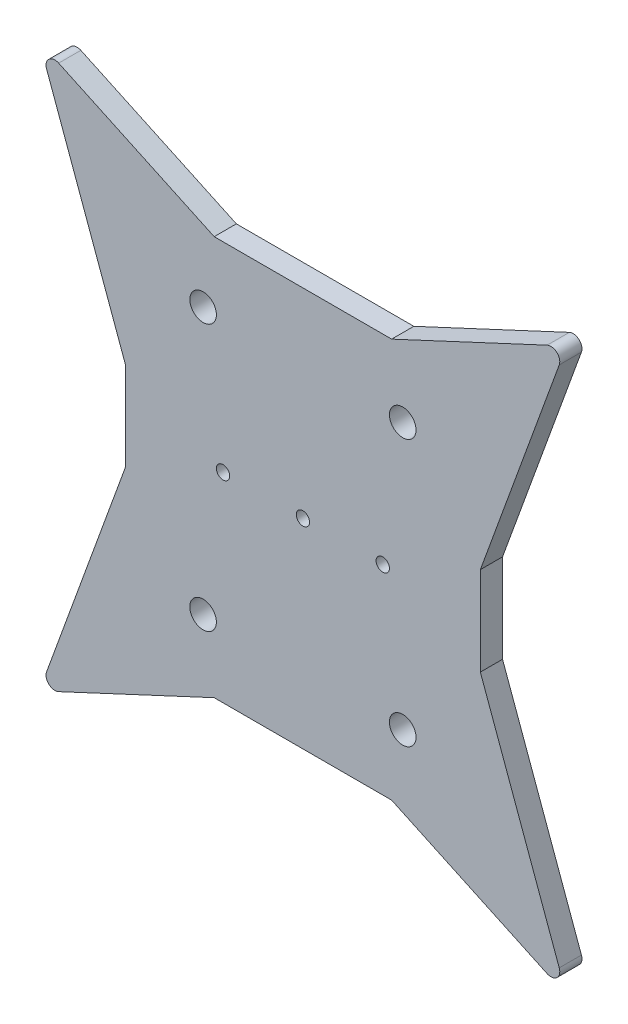
ISO-10303-21;
HEADER;
FILE_DESCRIPTION(('STEP AP214'),'2;1');
FILE_NAME('part.step','',(''),(''),'','','');
FILE_SCHEMA(('AUTOMOTIVE_DESIGN { 1 0 10303 214 1 1 1 1 }'));
ENDSEC;
DATA;
#1=APPLICATION_CONTEXT('core data for automotive mechanical design processes');
#2=APPLICATION_PROTOCOL_DEFINITION('international standard','automotive_design',2000,#1);
#3=PRODUCT_CONTEXT('',#1,'mechanical');
#4=PRODUCT('Part','Part','',(#3));
#5=PRODUCT_RELATED_PRODUCT_CATEGORY('part','',(#4));
#6=PRODUCT_DEFINITION_FORMATION('','',#4);
#7=PRODUCT_DEFINITION_CONTEXT('part definition',#1,'design');
#8=PRODUCT_DEFINITION('design','',#6,#7);
#9=PRODUCT_DEFINITION_SHAPE('','',#8);
#10=(LENGTH_UNIT() NAMED_UNIT(*) SI_UNIT(.MILLI.,.METRE.));
#11=(NAMED_UNIT(*) PLANE_ANGLE_UNIT() SI_UNIT($,.RADIAN.));
#12=(NAMED_UNIT(*) SI_UNIT($,.STERADIAN.) SOLID_ANGLE_UNIT());
#13=UNCERTAINTY_MEASURE_WITH_UNIT(LENGTH_MEASURE(1.E-05),#10,'distance_accuracy_value','');
#14=(GEOMETRIC_REPRESENTATION_CONTEXT(3) GLOBAL_UNCERTAINTY_ASSIGNED_CONTEXT((#13)) GLOBAL_UNIT_ASSIGNED_CONTEXT((#10,
#11,#12)) REPRESENTATION_CONTEXT('',''));
#15=CARTESIAN_POINT('',(0.,0.,0.));
#16=DIRECTION('',(0.,0.,1.));
#17=DIRECTION('',(1.,0.,0.));
#18=AXIS2_PLACEMENT_3D('',#15,#16,#17);
#19=CARTESIAN_POINT('',(0.,0.,5.));
#20=DIRECTION('',(0.,0.,-1.));
#21=DIRECTION('',(-1.,0.,0.));
#22=AXIS2_PLACEMENT_3D('',#19,#20,#21);
#23=PLANE('',#22);
#24=DIRECTION('',(-0.34202014332567,-0.939692620785908,0.));
#25=VECTOR('',#24,1.);
#26=CARTESIAN_POINT('',(-59.4313259429875,-63.3871292584206,5.));
#27=LINE('',#26,#25);
#28=CARTESIAN_POINT('',(-40.,-9.99999999999999,5.));
#29=VERTEX_POINT('',#28);
#30=CARTESIAN_POINT('',(-57.7799066057443,-58.8498919192941,5.));
#31=VERTEX_POINT('',#30);
#32=EDGE_CURVE('E181',#29,#31,#27,.T.);
#33=ORIENTED_EDGE('',*,*,#32,.T.);
#34=CARTESIAN_POINT('',(-55.9005213641724,-59.5339322059455,5.));
#35=DIRECTION('',(0.,0.,-1.));
#36=DIRECTION('',(-1.,0.,0.));
#37=AXIS2_PLACEMENT_3D('',#34,#35,#36);
#38=CIRCLE('',#37,2.);
#39=CARTESIAN_POINT('',(-55.055284840691,-61.3465477800188,5.));
#40=VERTEX_POINT('',#39);
#41=EDGE_CURVE('E265',#31,#40,#38,.F.);
#42=ORIENTED_EDGE('',*,*,#41,.T.);
#43=DIRECTION('',(0.906307787036652,0.422618261740694,0.));
#44=VECTOR('',#43,1.);
#45=CARTESIAN_POINT('',(-20.,-45.,5.));
#46=LINE('',#45,#44);
#47=CARTESIAN_POINT('',(-20.,-45.,5.));
#48=VERTEX_POINT('',#47);
#49=EDGE_CURVE('E183',#40,#48,#46,.T.);
#50=ORIENTED_EDGE('',*,*,#49,.T.);
#51=DIRECTION('',(1.,0.,0.));
#52=VECTOR('',#51,1.);
#53=CARTESIAN_POINT('',(-20.,-45.,5.));
#54=LINE('',#53,#52);
#55=CARTESIAN_POINT('',(20.,-45.,5.));
#56=VERTEX_POINT('',#55);
#57=EDGE_CURVE('E188',#48,#56,#54,.T.);
#58=ORIENTED_EDGE('',*,*,#57,.T.);
#59=DIRECTION('',(0.906307787036652,-0.422618261740694,0.));
#60=VECTOR('',#59,1.);
#61=CARTESIAN_POINT('',(20.,-45.,5.));
#62=LINE('',#61,#60);
#63=CARTESIAN_POINT('',(55.0552848406911,-61.3465477800188,5.));
#64=VERTEX_POINT('',#63);
#65=EDGE_CURVE('E190',#56,#64,#62,.T.);
#66=ORIENTED_EDGE('',*,*,#65,.T.);
#67=CARTESIAN_POINT('',(55.9005213641724,-59.5339322059455,5.));
#68=DIRECTION('',(0.,0.,-1.));
#69=DIRECTION('',(-1.,0.,0.));
#70=AXIS2_PLACEMENT_3D('',#67,#68,#69);
#71=CIRCLE('',#70,2.);
#72=CARTESIAN_POINT('',(57.7799066057443,-58.8498919192942,5.));
#73=VERTEX_POINT('',#72);
#74=EDGE_CURVE('E263',#64,#73,#71,.F.);
#75=ORIENTED_EDGE('',*,*,#74,.T.);
#76=DIRECTION('',(-0.34202014332567,0.939692620785908,0.));
#77=VECTOR('',#76,1.);
#78=CARTESIAN_POINT('',(59.4313259429875,-63.3871292584206,5.));
#79=LINE('',#78,#77);
#80=CARTESIAN_POINT('',(40.,-9.99999999999998,5.));
#81=VERTEX_POINT('',#80);
#82=EDGE_CURVE('E193',#73,#81,#79,.T.);
#83=ORIENTED_EDGE('',*,*,#82,.T.);
#84=DIRECTION('',(0.,1.,0.));
#85=VECTOR('',#84,1.);
#86=CARTESIAN_POINT('',(40.,10.,5.));
#87=LINE('',#86,#85);
#88=CARTESIAN_POINT('',(40.,10.,5.));
#89=VERTEX_POINT('',#88);
#90=EDGE_CURVE('E195',#81,#89,#87,.T.);
#91=ORIENTED_EDGE('',*,*,#90,.T.);
#92=DIRECTION('',(0.34202014332567,0.939692620785908,0.));
#93=VECTOR('',#92,1.);
#94=CARTESIAN_POINT('',(59.4313259429875,63.3871292584206,5.));
#95=LINE('',#94,#93);
#96=CARTESIAN_POINT('',(57.7799066057443,58.8498919192942,5.));
#97=VERTEX_POINT('',#96);
#98=EDGE_CURVE('E197',#89,#97,#95,.T.);
#99=ORIENTED_EDGE('',*,*,#98,.T.);
#100=CARTESIAN_POINT('',(55.9005213641724,59.5339322059455,5.));
#101=DIRECTION('',(0.,0.,-1.));
#102=DIRECTION('',(-1.,0.,0.));
#103=AXIS2_PLACEMENT_3D('',#100,#101,#102);
#104=CIRCLE('',#103,2.);
#105=CARTESIAN_POINT('',(55.0552848406911,61.3465477800188,5.));
#106=VERTEX_POINT('',#105);
#107=EDGE_CURVE('E56',#97,#106,#104,.F.);
#108=ORIENTED_EDGE('',*,*,#107,.T.);
#109=DIRECTION('',(-0.906307787036652,-0.422618261740694,0.));
#110=VECTOR('',#109,1.);
#111=CARTESIAN_POINT('',(20.,45.,5.));
#112=LINE('',#111,#110);
#113=CARTESIAN_POINT('',(20.,45.,5.));
#114=VERTEX_POINT('',#113);
#115=EDGE_CURVE('E199',#106,#114,#112,.T.);
#116=ORIENTED_EDGE('',*,*,#115,.T.);
#117=DIRECTION('',(-1.,0.,0.));
#118=VECTOR('',#117,1.);
#119=CARTESIAN_POINT('',(-20.,45.,5.));
#120=LINE('',#119,#118);
#121=CARTESIAN_POINT('',(-20.,45.,5.));
#122=VERTEX_POINT('',#121);
#123=EDGE_CURVE('E201',#114,#122,#120,.T.);
#124=ORIENTED_EDGE('',*,*,#123,.T.);
#125=DIRECTION('',(-0.906307787036653,0.422618261740694,0.));
#126=VECTOR('',#125,1.);
#127=CARTESIAN_POINT('',(-20.,45.,5.));
#128=LINE('',#127,#126);
#129=CARTESIAN_POINT('',(-55.0552848406911,61.3465477800188,5.));
#130=VERTEX_POINT('',#129);
#131=EDGE_CURVE('E166',#122,#130,#128,.T.);
#132=ORIENTED_EDGE('',*,*,#131,.T.);
#133=CARTESIAN_POINT('',(-55.9005213641724,59.5339322059455,5.));
#134=DIRECTION('',(0.,0.,-1.));
#135=DIRECTION('',(-1.,0.,0.));
#136=AXIS2_PLACEMENT_3D('',#133,#134,#135);
#137=CIRCLE('',#136,2.);
#138=CARTESIAN_POINT('',(-57.7799066057443,58.8498919192942,5.));
#139=VERTEX_POINT('',#138);
#140=EDGE_CURVE('E162',#130,#139,#137,.F.);
#141=ORIENTED_EDGE('',*,*,#140,.T.);
#142=DIRECTION('',(0.34202014332567,-0.939692620785908,0.));
#143=VECTOR('',#142,1.);
#144=CARTESIAN_POINT('',(-59.4313259429875,63.3871292584206,5.));
#145=LINE('',#144,#143);
#146=CARTESIAN_POINT('',(-40.,9.99999999999999,5.));
#147=VERTEX_POINT('',#146);
#148=EDGE_CURVE('E153',#139,#147,#145,.T.);
#149=ORIENTED_EDGE('',*,*,#148,.T.);
#150=DIRECTION('',(0.,-1.,0.));
#151=VECTOR('',#150,1.);
#152=CARTESIAN_POINT('',(-40.,9.99999999999999,5.));
#153=LINE('',#152,#151);
#154=EDGE_CURVE('E158',#147,#29,#153,.T.);
#155=ORIENTED_EDGE('',*,*,#154,.T.);
#156=EDGE_LOOP('',(#33,#42,#50,#58,#66,#75,#83,#91,#99,#108,#116,#124,#132,#141,#149,#155));
#157=FACE_BOUND('',#156,.T.);
#158=CARTESIAN_POINT('',(-22.5,30.,5.));
#159=DIRECTION('',(0.,0.,1.));
#160=DIRECTION('',(1.,0.,0.));
#161=AXIS2_PLACEMENT_3D('',#158,#159,#160);
#162=CIRCLE('',#161,2.99999999999999);
#163=CARTESIAN_POINT('',(-19.5,30.,5.));
#164=VERTEX_POINT('',#163);
#165=EDGE_CURVE('E207',#164,#164,#162,.T.);
#166=ORIENTED_EDGE('',*,*,#165,.F.);
#167=EDGE_LOOP('',(#166));
#168=FACE_BOUND('',#167,.T.);
#169=CARTESIAN_POINT('',(0.,0.,5.));
#170=DIRECTION('',(0.,0.,1.));
#171=DIRECTION('',(1.,0.,0.));
#172=AXIS2_PLACEMENT_3D('',#169,#170,#171);
#173=CIRCLE('',#172,1.5);
#174=CARTESIAN_POINT('',(1.5,0.,5.));
#175=VERTEX_POINT('',#174);
#176=EDGE_CURVE('E339',#175,#175,#173,.T.);
#177=ORIENTED_EDGE('',*,*,#176,.F.);
#178=EDGE_LOOP('',(#177));
#179=FACE_BOUND('',#178,.T.);
#180=CARTESIAN_POINT('',(22.5,30.,5.));
#181=DIRECTION('',(0.,0.,1.));
#182=DIRECTION('',(1.,0.,0.));
#183=AXIS2_PLACEMENT_3D('',#180,#181,#182);
#184=CIRCLE('',#183,2.99999999999995);
#185=CARTESIAN_POINT('',(25.5,30.,5.));
#186=VERTEX_POINT('',#185);
#187=EDGE_CURVE('E345',#186,#186,#184,.T.);
#188=ORIENTED_EDGE('',*,*,#187,.F.);
#189=EDGE_LOOP('',(#188));
#190=FACE_BOUND('',#189,.T.);
#191=CARTESIAN_POINT('',(22.5,-30.,5.));
#192=DIRECTION('',(0.,0.,1.));
#193=DIRECTION('',(1.,0.,0.));
#194=AXIS2_PLACEMENT_3D('',#191,#192,#193);
#195=CIRCLE('',#194,2.99999999999999);
#196=CARTESIAN_POINT('',(25.5,-30.,5.));
#197=VERTEX_POINT('',#196);
#198=EDGE_CURVE('E351',#197,#197,#195,.T.);
#199=ORIENTED_EDGE('',*,*,#198,.F.);
#200=EDGE_LOOP('',(#199));
#201=FACE_BOUND('',#200,.T.);
#202=CARTESIAN_POINT('',(-22.5,-30.,5.));
#203=DIRECTION('',(0.,0.,1.));
#204=DIRECTION('',(1.,0.,0.));
#205=AXIS2_PLACEMENT_3D('',#202,#203,#204);
#206=CIRCLE('',#205,3.);
#207=CARTESIAN_POINT('',(-19.5,-30.,5.));
#208=VERTEX_POINT('',#207);
#209=EDGE_CURVE('E357',#208,#208,#206,.T.);
#210=ORIENTED_EDGE('',*,*,#209,.F.);
#211=EDGE_LOOP('',(#210));
#212=FACE_BOUND('',#211,.T.);
#213=CARTESIAN_POINT('',(-18.,0.,5.));
#214=DIRECTION('',(0.,0.,1.));
#215=DIRECTION('',(1.,0.,0.));
#216=AXIS2_PLACEMENT_3D('',#213,#214,#215);
#217=CIRCLE('',#216,1.5);
#218=CARTESIAN_POINT('',(-16.5,0.,5.));
#219=VERTEX_POINT('',#218);
#220=EDGE_CURVE('E363',#219,#219,#217,.T.);
#221=ORIENTED_EDGE('',*,*,#220,.F.);
#222=EDGE_LOOP('',(#221));
#223=FACE_BOUND('',#222,.T.);
#224=CARTESIAN_POINT('',(18.,0.,5.));
#225=DIRECTION('',(0.,0.,1.));
#226=DIRECTION('',(1.,0.,0.));
#227=AXIS2_PLACEMENT_3D('',#224,#225,#226);
#228=CIRCLE('',#227,1.5);
#229=CARTESIAN_POINT('',(19.5,0.,5.));
#230=VERTEX_POINT('',#229);
#231=EDGE_CURVE('E369',#230,#230,#228,.T.);
#232=ORIENTED_EDGE('',*,*,#231,.F.);
#233=EDGE_LOOP('',(#232));
#234=FACE_BOUND('',#233,.T.);
#235=ADVANCED_FACE('F41',(#157,#168,#179,#190,#201,#212,#223,#234),#23,.F.);
#236=CARTESIAN_POINT('',(0.,0.,0.));
#237=DIRECTION('',(0.,0.,-1.));
#238=DIRECTION('',(-1.,0.,0.));
#239=AXIS2_PLACEMENT_3D('',#236,#237,#238);
#240=PLANE('',#239);
#241=CARTESIAN_POINT('',(-18.,0.,0.));
#242=DIRECTION('',(0.,0.,1.));
#243=DIRECTION('',(1.,0.,0.));
#244=AXIS2_PLACEMENT_3D('',#241,#242,#243);
#245=CIRCLE('',#244,1.5);
#246=CARTESIAN_POINT('',(-16.5,0.,0.));
#247=VERTEX_POINT('',#246);
#248=EDGE_CURVE('E366',#247,#247,#245,.T.);
#249=ORIENTED_EDGE('',*,*,#248,.T.);
#250=EDGE_LOOP('',(#249));
#251=FACE_BOUND('',#250,.T.);
#252=CARTESIAN_POINT('',(22.5,-30.,0.));
#253=DIRECTION('',(0.,0.,1.));
#254=DIRECTION('',(1.,0.,0.));
#255=AXIS2_PLACEMENT_3D('',#252,#253,#254);
#256=CIRCLE('',#255,2.99999999999999);
#257=CARTESIAN_POINT('',(25.5,-30.,0.));
#258=VERTEX_POINT('',#257);
#259=EDGE_CURVE('E354',#258,#258,#256,.T.);
#260=ORIENTED_EDGE('',*,*,#259,.T.);
#261=EDGE_LOOP('',(#260));
#262=FACE_BOUND('',#261,.T.);
#263=CARTESIAN_POINT('',(0.,0.,0.));
#264=DIRECTION('',(0.,0.,1.));
#265=DIRECTION('',(1.,0.,0.));
#266=AXIS2_PLACEMENT_3D('',#263,#264,#265);
#267=CIRCLE('',#266,1.5);
#268=CARTESIAN_POINT('',(1.5,0.,0.));
#269=VERTEX_POINT('',#268);
#270=EDGE_CURVE('E342',#269,#269,#267,.T.);
#271=ORIENTED_EDGE('',*,*,#270,.T.);
#272=EDGE_LOOP('',(#271));
#273=FACE_BOUND('',#272,.T.);
#274=DIRECTION('',(0.906307787036652,0.422618261740694,0.));
#275=VECTOR('',#274,1.);
#276=CARTESIAN_POINT('',(-20.,-45.,0.));
#277=LINE('',#276,#275);
#278=CARTESIAN_POINT('',(-55.055284840691,-61.3465477800188,0.));
#279=VERTEX_POINT('',#278);
#280=CARTESIAN_POINT('',(-20.,-45.,0.));
#281=VERTEX_POINT('',#280);
#282=EDGE_CURVE('E214',#279,#281,#277,.T.);
#283=ORIENTED_EDGE('',*,*,#282,.F.);
#284=CARTESIAN_POINT('',(-55.9005213641724,-59.5339322059455,0.));
#285=DIRECTION('',(0.,0.,-1.));
#286=DIRECTION('',(-1.,0.,0.));
#287=AXIS2_PLACEMENT_3D('',#284,#285,#286);
#288=CIRCLE('',#287,2.);
#289=CARTESIAN_POINT('',(-57.7799066057443,-58.8498919192941,0.));
#290=VERTEX_POINT('',#289);
#291=EDGE_CURVE('E257',#279,#290,#288,.T.);
#292=ORIENTED_EDGE('',*,*,#291,.T.);
#293=DIRECTION('',(-0.34202014332567,-0.939692620785908,0.));
#294=VECTOR('',#293,1.);
#295=CARTESIAN_POINT('',(-59.4313259429875,-63.3871292584206,0.));
#296=LINE('',#295,#294);
#297=CARTESIAN_POINT('',(-40.,-9.99999999999999,0.));
#298=VERTEX_POINT('',#297);
#299=EDGE_CURVE('E211',#298,#290,#296,.T.);
#300=ORIENTED_EDGE('',*,*,#299,.F.);
#301=DIRECTION('',(0.,-1.,0.));
#302=VECTOR('',#301,1.);
#303=CARTESIAN_POINT('',(-40.,9.99999999999999,0.));
#304=LINE('',#303,#302);
#305=CARTESIAN_POINT('',(-40.,9.99999999999999,0.));
#306=VERTEX_POINT('',#305);
#307=EDGE_CURVE('E209',#306,#298,#304,.T.);
#308=ORIENTED_EDGE('',*,*,#307,.F.);
#309=DIRECTION('',(0.34202014332567,-0.939692620785908,0.));
#310=VECTOR('',#309,1.);
#311=CARTESIAN_POINT('',(-59.4313259429875,63.3871292584206,0.));
#312=LINE('',#311,#310);
#313=CARTESIAN_POINT('',(-57.7799066057443,58.8498919192942,0.));
#314=VERTEX_POINT('',#313);
#315=EDGE_CURVE('E172',#314,#306,#312,.T.);
#316=ORIENTED_EDGE('',*,*,#315,.F.);
#317=CARTESIAN_POINT('',(-55.9005213641724,59.5339322059455,0.));
#318=DIRECTION('',(0.,0.,-1.));
#319=DIRECTION('',(-1.,0.,0.));
#320=AXIS2_PLACEMENT_3D('',#317,#318,#319);
#321=CIRCLE('',#320,2.);
#322=CARTESIAN_POINT('',(-55.0552848406911,61.3465477800188,0.));
#323=VERTEX_POINT('',#322);
#324=EDGE_CURVE('E251',#314,#323,#321,.T.);
#325=ORIENTED_EDGE('',*,*,#324,.T.);
#326=DIRECTION('',(-0.906307787036653,0.422618261740694,0.));
#327=VECTOR('',#326,1.);
#328=CARTESIAN_POINT('',(-20.,45.,0.));
#329=LINE('',#328,#327);
#330=CARTESIAN_POINT('',(-20.,45.,0.));
#331=VERTEX_POINT('',#330);
#332=EDGE_CURVE('E204',#331,#323,#329,.T.);
#333=ORIENTED_EDGE('',*,*,#332,.F.);
#334=DIRECTION('',(-1.,0.,0.));
#335=VECTOR('',#334,1.);
#336=CARTESIAN_POINT('',(-20.,45.,0.));
#337=LINE('',#336,#335);
#338=CARTESIAN_POINT('',(20.,45.,0.));
#339=VERTEX_POINT('',#338);
#340=EDGE_CURVE('E229',#339,#331,#337,.T.);
#341=ORIENTED_EDGE('',*,*,#340,.F.);
#342=DIRECTION('',(-0.906307787036652,-0.422618261740694,0.));
#343=VECTOR('',#342,1.);
#344=CARTESIAN_POINT('',(20.,45.,0.));
#345=LINE('',#344,#343);
#346=CARTESIAN_POINT('',(55.0552848406911,61.3465477800188,0.));
#347=VERTEX_POINT('',#346);
#348=EDGE_CURVE('E227',#347,#339,#345,.T.);
#349=ORIENTED_EDGE('',*,*,#348,.F.);
#350=CARTESIAN_POINT('',(55.9005213641724,59.5339322059455,0.));
#351=DIRECTION('',(0.,0.,-1.));
#352=DIRECTION('',(-1.,0.,0.));
#353=AXIS2_PLACEMENT_3D('',#350,#351,#352);
#354=CIRCLE('',#353,2.);
#355=CARTESIAN_POINT('',(57.7799066057443,58.8498919192942,0.));
#356=VERTEX_POINT('',#355);
#357=EDGE_CURVE('E253',#347,#356,#354,.T.);
#358=ORIENTED_EDGE('',*,*,#357,.T.);
#359=DIRECTION('',(0.34202014332567,0.939692620785908,0.));
#360=VECTOR('',#359,1.);
#361=CARTESIAN_POINT('',(59.4313259429875,63.3871292584206,0.));
#362=LINE('',#361,#360);
#363=CARTESIAN_POINT('',(40.,10.,0.));
#364=VERTEX_POINT('',#363);
#365=EDGE_CURVE('E225',#364,#356,#362,.T.);
#366=ORIENTED_EDGE('',*,*,#365,.F.);
#367=DIRECTION('',(0.,1.,0.));
#368=VECTOR('',#367,1.);
#369=CARTESIAN_POINT('',(40.,10.,0.));
#370=LINE('',#369,#368);
#371=CARTESIAN_POINT('',(40.,-9.99999999999998,0.));
#372=VERTEX_POINT('',#371);
#373=EDGE_CURVE('E223',#372,#364,#370,.T.);
#374=ORIENTED_EDGE('',*,*,#373,.F.);
#375=DIRECTION('',(-0.34202014332567,0.939692620785908,0.));
#376=VECTOR('',#375,1.);
#377=CARTESIAN_POINT('',(59.4313259429875,-63.3871292584206,0.));
#378=LINE('',#377,#376);
#379=CARTESIAN_POINT('',(57.7799066057443,-58.8498919192942,0.));
#380=VERTEX_POINT('',#379);
#381=EDGE_CURVE('E221',#380,#372,#378,.T.);
#382=ORIENTED_EDGE('',*,*,#381,.F.);
#383=CARTESIAN_POINT('',(55.9005213641724,-59.5339322059455,0.));
#384=DIRECTION('',(0.,0.,-1.));
#385=DIRECTION('',(-1.,0.,0.));
#386=AXIS2_PLACEMENT_3D('',#383,#384,#385);
#387=CIRCLE('',#386,2.);
#388=CARTESIAN_POINT('',(55.0552848406911,-61.3465477800188,0.));
#389=VERTEX_POINT('',#388);
#390=EDGE_CURVE('E255',#380,#389,#387,.T.);
#391=ORIENTED_EDGE('',*,*,#390,.T.);
#392=DIRECTION('',(0.906307787036652,-0.422618261740694,0.));
#393=VECTOR('',#392,1.);
#394=CARTESIAN_POINT('',(20.,-45.,0.));
#395=LINE('',#394,#393);
#396=CARTESIAN_POINT('',(20.,-45.,0.));
#397=VERTEX_POINT('',#396);
#398=EDGE_CURVE('E218',#397,#389,#395,.T.);
#399=ORIENTED_EDGE('',*,*,#398,.F.);
#400=DIRECTION('',(1.,0.,0.));
#401=VECTOR('',#400,1.);
#402=CARTESIAN_POINT('',(-20.,-45.,0.));
#403=LINE('',#402,#401);
#404=EDGE_CURVE('E216',#281,#397,#403,.T.);
#405=ORIENTED_EDGE('',*,*,#404,.F.);
#406=EDGE_LOOP('',(#283,#292,#300,#308,#316,#325,#333,#341,#349,#358,#366,#374,#382,#391,#399,#405));
#407=FACE_BOUND('',#406,.T.);
#408=CARTESIAN_POINT('',(-22.5,30.,0.));
#409=DIRECTION('',(0.,0.,1.));
#410=DIRECTION('',(1.,0.,0.));
#411=AXIS2_PLACEMENT_3D('',#408,#409,#410);
#412=CIRCLE('',#411,2.99999999999999);
#413=CARTESIAN_POINT('',(-19.5,30.,0.));
#414=VERTEX_POINT('',#413);
#415=EDGE_CURVE('E336',#414,#414,#412,.T.);
#416=ORIENTED_EDGE('',*,*,#415,.T.);
#417=EDGE_LOOP('',(#416));
#418=FACE_BOUND('',#417,.T.);
#419=CARTESIAN_POINT('',(22.5,30.,0.));
#420=DIRECTION('',(0.,0.,1.));
#421=DIRECTION('',(1.,0.,0.));
#422=AXIS2_PLACEMENT_3D('',#419,#420,#421);
#423=CIRCLE('',#422,2.99999999999995);
#424=CARTESIAN_POINT('',(25.5,30.,0.));
#425=VERTEX_POINT('',#424);
#426=EDGE_CURVE('E348',#425,#425,#423,.T.);
#427=ORIENTED_EDGE('',*,*,#426,.T.);
#428=EDGE_LOOP('',(#427));
#429=FACE_BOUND('',#428,.T.);
#430=CARTESIAN_POINT('',(-22.5,-30.,0.));
#431=DIRECTION('',(0.,0.,1.));
#432=DIRECTION('',(1.,0.,0.));
#433=AXIS2_PLACEMENT_3D('',#430,#431,#432);
#434=CIRCLE('',#433,3.);
#435=CARTESIAN_POINT('',(-19.5,-30.,0.));
#436=VERTEX_POINT('',#435);
#437=EDGE_CURVE('E360',#436,#436,#434,.T.);
#438=ORIENTED_EDGE('',*,*,#437,.T.);
#439=EDGE_LOOP('',(#438));
#440=FACE_BOUND('',#439,.T.);
#441=CARTESIAN_POINT('',(18.,0.,0.));
#442=DIRECTION('',(0.,0.,1.));
#443=DIRECTION('',(1.,0.,0.));
#444=AXIS2_PLACEMENT_3D('',#441,#442,#443);
#445=CIRCLE('',#444,1.5);
#446=CARTESIAN_POINT('',(19.5,0.,0.));
#447=VERTEX_POINT('',#446);
#448=EDGE_CURVE('E372',#447,#447,#445,.T.);
#449=ORIENTED_EDGE('',*,*,#448,.T.);
#450=EDGE_LOOP('',(#449));
#451=FACE_BOUND('',#450,.T.);
#452=ADVANCED_FACE('F278',(#251,#262,#273,#407,#418,#429,#440,#451),#240,.T.);
#453=CARTESIAN_POINT('',(-20.,45.,5.));
#454=DIRECTION('',(-0.422618261740694,-0.906307787036653,0.));
#455=DIRECTION('',(0.906307787036653,-0.422618261740694,0.));
#456=AXIS2_PLACEMENT_3D('',#453,#454,#455);
#457=PLANE('',#456);
#458=ORIENTED_EDGE('',*,*,#332,.T.);
#459=DIRECTION('',(0.,0.,-1.));
#460=VECTOR('',#459,1.);
#461=CARTESIAN_POINT('',(-55.0552848406911,61.3465477800188,5.));
#462=LINE('',#461,#460);
#463=EDGE_CURVE('E11',#323,#130,#462,.F.);
#464=ORIENTED_EDGE('',*,*,#463,.T.);
#465=ORIENTED_EDGE('',*,*,#131,.F.);
#466=DIRECTION('',(0.,0.,-1.));
#467=VECTOR('',#466,1.);
#468=CARTESIAN_POINT('',(-20.,45.,5.));
#469=LINE('',#468,#467);
#470=EDGE_CURVE('E203',#122,#331,#469,.T.);
#471=ORIENTED_EDGE('',*,*,#470,.T.);
#472=EDGE_LOOP('',(#458,#464,#465,#471));
#473=FACE_BOUND('',#472,.T.);
#474=ADVANCED_FACE('F333',(#473),#457,.F.);
#475=CARTESIAN_POINT('',(-59.4313259429875,63.3871292584206,5.));
#476=DIRECTION('',(0.939692620785908,0.34202014332567,0.));
#477=DIRECTION('',(-0.34202014332567,0.939692620785908,0.));
#478=AXIS2_PLACEMENT_3D('',#475,#476,#477);
#479=PLANE('',#478);
#480=ORIENTED_EDGE('',*,*,#148,.F.);
#481=DIRECTION('',(0.,0.,-1.));
#482=VECTOR('',#481,1.);
#483=CARTESIAN_POINT('',(-57.7799066057443,58.8498919192942,5.));
#484=LINE('',#483,#482);
#485=EDGE_CURVE('E49',#139,#314,#484,.T.);
#486=ORIENTED_EDGE('',*,*,#485,.T.);
#487=ORIENTED_EDGE('',*,*,#315,.T.);
#488=DIRECTION('',(0.,0.,-1.));
#489=VECTOR('',#488,1.);
#490=CARTESIAN_POINT('',(-40.,9.99999999999999,5.));
#491=LINE('',#490,#489);
#492=EDGE_CURVE('E169',#147,#306,#491,.T.);
#493=ORIENTED_EDGE('',*,*,#492,.F.);
#494=EDGE_LOOP('',(#480,#486,#487,#493));
#495=FACE_BOUND('',#494,.T.);
#496=ADVANCED_FACE('F170',(#495),#479,.F.);
#497=CARTESIAN_POINT('',(-40.,9.99999999999999,5.));
#498=DIRECTION('',(1.,0.,0.));
#499=DIRECTION('',(0.,0.,-1.));
#500=AXIS2_PLACEMENT_3D('',#497,#498,#499);
#501=PLANE('',#500);
#502=ORIENTED_EDGE('',*,*,#307,.T.);
#503=DIRECTION('',(0.,0.,-1.));
#504=VECTOR('',#503,1.);
#505=CARTESIAN_POINT('',(-40.,-9.99999999999999,5.));
#506=LINE('',#505,#504);
#507=EDGE_CURVE('E176',#29,#298,#506,.T.);
#508=ORIENTED_EDGE('',*,*,#507,.F.);
#509=ORIENTED_EDGE('',*,*,#154,.F.);
#510=ORIENTED_EDGE('',*,*,#492,.T.);
#511=EDGE_LOOP('',(#502,#508,#509,#510));
#512=FACE_BOUND('',#511,.T.);
#513=ADVANCED_FACE('F178',(#512),#501,.F.);
#514=CARTESIAN_POINT('',(-59.4313259429875,-63.3871292584206,5.));
#515=DIRECTION('',(0.939692620785908,-0.34202014332567,0.));
#516=DIRECTION('',(0.34202014332567,0.939692620785908,0.));
#517=AXIS2_PLACEMENT_3D('',#514,#515,#516);
#518=PLANE('',#517);
#519=ORIENTED_EDGE('',*,*,#299,.T.);
#520=DIRECTION('',(0.,0.,-1.));
#521=VECTOR('',#520,1.);
#522=CARTESIAN_POINT('',(-57.7799066057443,-58.8498919192941,5.));
#523=LINE('',#522,#521);
#524=EDGE_CURVE('E259',#290,#31,#523,.F.);
#525=ORIENTED_EDGE('',*,*,#524,.T.);
#526=ORIENTED_EDGE('',*,*,#32,.F.);
#527=ORIENTED_EDGE('',*,*,#507,.T.);
#528=EDGE_LOOP('',(#519,#525,#526,#527));
#529=FACE_BOUND('',#528,.T.);
#530=ADVANCED_FACE('F283',(#529),#518,.F.);
#531=CARTESIAN_POINT('',(-20.,-45.,5.));
#532=DIRECTION('',(-0.422618261740694,0.906307787036652,0.));
#533=DIRECTION('',(-0.906307787036652,-0.422618261740694,0.));
#534=AXIS2_PLACEMENT_3D('',#531,#532,#533);
#535=PLANE('',#534);
#536=ORIENTED_EDGE('',*,*,#49,.F.);
#537=DIRECTION('',(0.,0.,-1.));
#538=VECTOR('',#537,1.);
#539=CARTESIAN_POINT('',(-55.055284840691,-61.3465477800188,5.));
#540=LINE('',#539,#538);
#541=EDGE_CURVE('E175',#40,#279,#540,.T.);
#542=ORIENTED_EDGE('',*,*,#541,.T.);
#543=ORIENTED_EDGE('',*,*,#282,.T.);
#544=DIRECTION('',(0.,0.,-1.));
#545=VECTOR('',#544,1.);
#546=CARTESIAN_POINT('',(-20.,-45.,5.));
#547=LINE('',#546,#545);
#548=EDGE_CURVE('E245',#48,#281,#547,.T.);
#549=ORIENTED_EDGE('',*,*,#548,.F.);
#550=EDGE_LOOP('',(#536,#542,#543,#549));
#551=FACE_BOUND('',#550,.T.);
#552=ADVANCED_FACE('F291',(#551),#535,.F.);
#553=CARTESIAN_POINT('',(-20.,-45.,5.));
#554=DIRECTION('',(0.,1.,0.));
#555=DIRECTION('',(-1.,0.,0.));
#556=AXIS2_PLACEMENT_3D('',#553,#554,#555);
#557=PLANE('',#556);
#558=ORIENTED_EDGE('',*,*,#404,.T.);
#559=DIRECTION('',(0.,0.,-1.));
#560=VECTOR('',#559,1.);
#561=CARTESIAN_POINT('',(20.,-45.,5.));
#562=LINE('',#561,#560);
#563=EDGE_CURVE('E242',#56,#397,#562,.T.);
#564=ORIENTED_EDGE('',*,*,#563,.F.);
#565=ORIENTED_EDGE('',*,*,#57,.F.);
#566=ORIENTED_EDGE('',*,*,#548,.T.);
#567=EDGE_LOOP('',(#558,#564,#565,#566));
#568=FACE_BOUND('',#567,.T.);
#569=ADVANCED_FACE('F297',(#568),#557,.F.);
#570=CARTESIAN_POINT('',(20.,-45.,5.));
#571=DIRECTION('',(0.422618261740694,0.906307787036652,0.));
#572=DIRECTION('',(-0.906307787036652,0.422618261740694,0.));
#573=AXIS2_PLACEMENT_3D('',#570,#571,#572);
#574=PLANE('',#573);
#575=ORIENTED_EDGE('',*,*,#398,.T.);
#576=DIRECTION('',(0.,0.,-1.));
#577=VECTOR('',#576,1.);
#578=CARTESIAN_POINT('',(55.0552848406911,-61.3465477800188,5.));
#579=LINE('',#578,#577);
#580=EDGE_CURVE('E270',#389,#64,#579,.F.);
#581=ORIENTED_EDGE('',*,*,#580,.T.);
#582=ORIENTED_EDGE('',*,*,#65,.F.);
#583=ORIENTED_EDGE('',*,*,#563,.T.);
#584=EDGE_LOOP('',(#575,#581,#582,#583));
#585=FACE_BOUND('',#584,.T.);
#586=ADVANCED_FACE('F301',(#585),#574,.F.);
#587=CARTESIAN_POINT('',(59.4313259429875,-63.3871292584206,5.));
#588=DIRECTION('',(-0.939692620785908,-0.34202014332567,0.));
#589=DIRECTION('',(0.34202014332567,-0.939692620785908,0.));
#590=AXIS2_PLACEMENT_3D('',#587,#588,#589);
#591=PLANE('',#590);
#592=ORIENTED_EDGE('',*,*,#82,.F.);
#593=DIRECTION('',(0.,0.,-1.));
#594=VECTOR('',#593,1.);
#595=CARTESIAN_POINT('',(57.7799066057443,-58.8498919192942,5.));
#596=LINE('',#595,#594);
#597=EDGE_CURVE('E267',#73,#380,#596,.T.);
#598=ORIENTED_EDGE('',*,*,#597,.T.);
#599=ORIENTED_EDGE('',*,*,#381,.T.);
#600=DIRECTION('',(0.,0.,-1.));
#601=VECTOR('',#600,1.);
#602=CARTESIAN_POINT('',(40.,-9.99999999999998,5.));
#603=LINE('',#602,#601);
#604=EDGE_CURVE('E239',#81,#372,#603,.T.);
#605=ORIENTED_EDGE('',*,*,#604,.F.);
#606=EDGE_LOOP('',(#592,#598,#599,#605));
#607=FACE_BOUND('',#606,.T.);
#608=ADVANCED_FACE('F310',(#607),#591,.F.);
#609=CARTESIAN_POINT('',(40.,10.,5.));
#610=DIRECTION('',(-1.,0.,0.));
#611=DIRECTION('',(0.,0.,1.));
#612=AXIS2_PLACEMENT_3D('',#609,#610,#611);
#613=PLANE('',#612);
#614=ORIENTED_EDGE('',*,*,#373,.T.);
#615=DIRECTION('',(0.,0.,-1.));
#616=VECTOR('',#615,1.);
#617=CARTESIAN_POINT('',(40.,10.,5.));
#618=LINE('',#617,#616);
#619=EDGE_CURVE('E236',#89,#364,#618,.T.);
#620=ORIENTED_EDGE('',*,*,#619,.F.);
#621=ORIENTED_EDGE('',*,*,#90,.F.);
#622=ORIENTED_EDGE('',*,*,#604,.T.);
#623=EDGE_LOOP('',(#614,#620,#621,#622));
#624=FACE_BOUND('',#623,.T.);
#625=ADVANCED_FACE('F316',(#624),#613,.F.);
#626=CARTESIAN_POINT('',(59.4313259429875,63.3871292584206,5.));
#627=DIRECTION('',(-0.939692620785908,0.34202014332567,0.));
#628=DIRECTION('',(-0.34202014332567,-0.939692620785908,0.));
#629=AXIS2_PLACEMENT_3D('',#626,#627,#628);
#630=PLANE('',#629);
#631=ORIENTED_EDGE('',*,*,#365,.T.);
#632=DIRECTION('',(0.,0.,-1.));
#633=VECTOR('',#632,1.);
#634=CARTESIAN_POINT('',(57.7799066057443,58.8498919192942,5.));
#635=LINE('',#634,#633);
#636=EDGE_CURVE('E64',#356,#97,#635,.F.);
#637=ORIENTED_EDGE('',*,*,#636,.T.);
#638=ORIENTED_EDGE('',*,*,#98,.F.);
#639=ORIENTED_EDGE('',*,*,#619,.T.);
#640=EDGE_LOOP('',(#631,#637,#638,#639));
#641=FACE_BOUND('',#640,.T.);
#642=ADVANCED_FACE('F318',(#641),#630,.F.);
#643=CARTESIAN_POINT('',(20.,45.,5.));
#644=DIRECTION('',(0.422618261740694,-0.906307787036652,0.));
#645=DIRECTION('',(0.906307787036652,0.422618261740694,0.));
#646=AXIS2_PLACEMENT_3D('',#643,#644,#645);
#647=PLANE('',#646);
#648=ORIENTED_EDGE('',*,*,#115,.F.);
#649=DIRECTION('',(0.,0.,-1.));
#650=VECTOR('',#649,1.);
#651=CARTESIAN_POINT('',(55.055284840691,61.3465477800188,5.));
#652=LINE('',#651,#650);
#653=EDGE_CURVE('E272',#106,#347,#652,.T.);
#654=ORIENTED_EDGE('',*,*,#653,.T.);
#655=ORIENTED_EDGE('',*,*,#348,.T.);
#656=DIRECTION('',(0.,0.,-1.));
#657=VECTOR('',#656,1.);
#658=CARTESIAN_POINT('',(20.,45.,5.));
#659=LINE('',#658,#657);
#660=EDGE_CURVE('E233',#114,#339,#659,.T.);
#661=ORIENTED_EDGE('',*,*,#660,.F.);
#662=EDGE_LOOP('',(#648,#654,#655,#661));
#663=FACE_BOUND('',#662,.T.);
#664=ADVANCED_FACE('F324',(#663),#647,.F.);
#665=CARTESIAN_POINT('',(-20.,45.,5.));
#666=DIRECTION('',(0.,-1.,0.));
#667=DIRECTION('',(1.,0.,0.));
#668=AXIS2_PLACEMENT_3D('',#665,#666,#667);
#669=PLANE('',#668);
#670=ORIENTED_EDGE('',*,*,#340,.T.);
#671=ORIENTED_EDGE('',*,*,#470,.F.);
#672=ORIENTED_EDGE('',*,*,#123,.F.);
#673=ORIENTED_EDGE('',*,*,#660,.T.);
#674=EDGE_LOOP('',(#670,#671,#672,#673));
#675=FACE_BOUND('',#674,.T.);
#676=ADVANCED_FACE('F329',(#675),#669,.F.);
#677=CARTESIAN_POINT('',(-22.5,30.,5.));
#678=DIRECTION('',(0.,0.,-1.));
#679=DIRECTION('',(-1.,0.,0.));
#680=AXIS2_PLACEMENT_3D('',#677,#678,#679);
#681=CYLINDRICAL_SURFACE('',#680,2.99999999999999);
#682=ORIENTED_EDGE('',*,*,#165,.T.);
#683=EDGE_LOOP('',(#682));
#684=FACE_BOUND('',#683,.T.);
#685=ORIENTED_EDGE('',*,*,#415,.F.);
#686=EDGE_LOOP('',(#685));
#687=FACE_BOUND('',#686,.T.);
#688=ADVANCED_FACE('F390',(#684,#687),#681,.F.);
#689=CARTESIAN_POINT('',(0.,0.,5.));
#690=DIRECTION('',(0.,0.,-1.));
#691=DIRECTION('',(-1.,0.,0.));
#692=AXIS2_PLACEMENT_3D('',#689,#690,#691);
#693=CYLINDRICAL_SURFACE('',#692,1.5);
#694=ORIENTED_EDGE('',*,*,#176,.T.);
#695=EDGE_LOOP('',(#694));
#696=FACE_BOUND('',#695,.T.);
#697=ORIENTED_EDGE('',*,*,#270,.F.);
#698=EDGE_LOOP('',(#697));
#699=FACE_BOUND('',#698,.T.);
#700=ADVANCED_FACE('F490',(#696,#699),#693,.F.);
#701=CARTESIAN_POINT('',(22.5,30.,5.));
#702=DIRECTION('',(0.,0.,-1.));
#703=DIRECTION('',(-1.,0.,0.));
#704=AXIS2_PLACEMENT_3D('',#701,#702,#703);
#705=CYLINDRICAL_SURFACE('',#704,2.99999999999995);
#706=ORIENTED_EDGE('',*,*,#187,.T.);
#707=EDGE_LOOP('',(#706));
#708=FACE_BOUND('',#707,.T.);
#709=ORIENTED_EDGE('',*,*,#426,.F.);
#710=EDGE_LOOP('',(#709));
#711=FACE_BOUND('',#710,.T.);
#712=ADVANCED_FACE('F480',(#708,#711),#705,.F.);
#713=CARTESIAN_POINT('',(22.5,-30.,5.));
#714=DIRECTION('',(0.,0.,-1.));
#715=DIRECTION('',(-1.,0.,0.));
#716=AXIS2_PLACEMENT_3D('',#713,#714,#715);
#717=CYLINDRICAL_SURFACE('',#716,2.99999999999999);
#718=ORIENTED_EDGE('',*,*,#198,.T.);
#719=EDGE_LOOP('',(#718));
#720=FACE_BOUND('',#719,.T.);
#721=ORIENTED_EDGE('',*,*,#259,.F.);
#722=EDGE_LOOP('',(#721));
#723=FACE_BOUND('',#722,.T.);
#724=ADVANCED_FACE('F470',(#720,#723),#717,.F.);
#725=CARTESIAN_POINT('',(-22.5,-30.,5.));
#726=DIRECTION('',(0.,0.,-1.));
#727=DIRECTION('',(-1.,0.,0.));
#728=AXIS2_PLACEMENT_3D('',#725,#726,#727);
#729=CYLINDRICAL_SURFACE('',#728,3.);
#730=ORIENTED_EDGE('',*,*,#209,.T.);
#731=EDGE_LOOP('',(#730));
#732=FACE_BOUND('',#731,.T.);
#733=ORIENTED_EDGE('',*,*,#437,.F.);
#734=EDGE_LOOP('',(#733));
#735=FACE_BOUND('',#734,.T.);
#736=ADVANCED_FACE('F460',(#732,#735),#729,.F.);
#737=CARTESIAN_POINT('',(-18.,0.,5.));
#738=DIRECTION('',(0.,0.,-1.));
#739=DIRECTION('',(-1.,0.,0.));
#740=AXIS2_PLACEMENT_3D('',#737,#738,#739);
#741=CYLINDRICAL_SURFACE('',#740,1.5);
#742=ORIENTED_EDGE('',*,*,#220,.T.);
#743=EDGE_LOOP('',(#742));
#744=FACE_BOUND('',#743,.T.);
#745=ORIENTED_EDGE('',*,*,#248,.F.);
#746=EDGE_LOOP('',(#745));
#747=FACE_BOUND('',#746,.T.);
#748=ADVANCED_FACE('F451',(#744,#747),#741,.F.);
#749=CARTESIAN_POINT('',(18.,0.,5.));
#750=DIRECTION('',(0.,0.,-1.));
#751=DIRECTION('',(-1.,0.,0.));
#752=AXIS2_PLACEMENT_3D('',#749,#750,#751);
#753=CYLINDRICAL_SURFACE('',#752,1.5);
#754=ORIENTED_EDGE('',*,*,#231,.T.);
#755=EDGE_LOOP('',(#754));
#756=FACE_BOUND('',#755,.T.);
#757=ORIENTED_EDGE('',*,*,#448,.F.);
#758=EDGE_LOOP('',(#757));
#759=FACE_BOUND('',#758,.T.);
#760=ADVANCED_FACE('F378',(#756,#759),#753,.F.);
#761=CARTESIAN_POINT('',(-55.9005213641724,-59.5339322059455,5.));
#762=DIRECTION('',(0.,0.,-1.));
#763=DIRECTION('',(-1.,0.,0.));
#764=AXIS2_PLACEMENT_3D('',#761,#762,#763);
#765=CYLINDRICAL_SURFACE('',#764,2.);
#766=ORIENTED_EDGE('',*,*,#41,.F.);
#767=ORIENTED_EDGE('',*,*,#524,.F.);
#768=ORIENTED_EDGE('',*,*,#291,.F.);
#769=ORIENTED_EDGE('',*,*,#541,.F.);
#770=EDGE_LOOP('',(#766,#767,#768,#769));
#771=FACE_BOUND('',#770,.T.);
#772=ADVANCED_FACE('F289',(#771),#765,.T.);
#773=CARTESIAN_POINT('',(55.9005213641724,-59.5339322059455,5.));
#774=DIRECTION('',(0.,0.,-1.));
#775=DIRECTION('',(-1.,0.,0.));
#776=AXIS2_PLACEMENT_3D('',#773,#774,#775);
#777=CYLINDRICAL_SURFACE('',#776,2.);
#778=ORIENTED_EDGE('',*,*,#74,.F.);
#779=ORIENTED_EDGE('',*,*,#580,.F.);
#780=ORIENTED_EDGE('',*,*,#390,.F.);
#781=ORIENTED_EDGE('',*,*,#597,.F.);
#782=EDGE_LOOP('',(#778,#779,#780,#781));
#783=FACE_BOUND('',#782,.T.);
#784=ADVANCED_FACE('F307',(#783),#777,.T.);
#785=CARTESIAN_POINT('',(55.9005213641724,59.5339322059455,5.));
#786=DIRECTION('',(0.,0.,-1.));
#787=DIRECTION('',(-1.,0.,0.));
#788=AXIS2_PLACEMENT_3D('',#785,#786,#787);
#789=CYLINDRICAL_SURFACE('',#788,2.);
#790=ORIENTED_EDGE('',*,*,#107,.F.);
#791=ORIENTED_EDGE('',*,*,#636,.F.);
#792=ORIENTED_EDGE('',*,*,#357,.F.);
#793=ORIENTED_EDGE('',*,*,#653,.F.);
#794=EDGE_LOOP('',(#790,#791,#792,#793));
#795=FACE_BOUND('',#794,.T.);
#796=ADVANCED_FACE('F321',(#795),#789,.T.);
#797=CARTESIAN_POINT('',(-55.9005213641724,59.5339322059455,5.));
#798=DIRECTION('',(0.,0.,-1.));
#799=DIRECTION('',(-1.,0.,0.));
#800=AXIS2_PLACEMENT_3D('',#797,#798,#799);
#801=CYLINDRICAL_SURFACE('',#800,2.);
#802=ORIENTED_EDGE('',*,*,#140,.F.);
#803=ORIENTED_EDGE('',*,*,#463,.F.);
#804=ORIENTED_EDGE('',*,*,#324,.F.);
#805=ORIENTED_EDGE('',*,*,#485,.F.);
#806=EDGE_LOOP('',(#802,#803,#804,#805));
#807=FACE_BOUND('',#806,.T.);
#808=ADVANCED_FACE('F43',(#807),#801,.T.);
#809=CLOSED_SHELL('',(#235,#452,#474,#496,#513,#530,#552,#569,#586,#608,#625,#642,#664,#676,
#688,#700,#712,#724,#736,#748,#760,#772,#784,#796,#808));
#810=MANIFOLD_SOLID_BREP('B2',#809);
#811=ADVANCED_BREP_SHAPE_REPRESENTATION('',(#18,#810),#14);
#812=SHAPE_DEFINITION_REPRESENTATION(#9,#811);
ENDSEC;
END-ISO-10303-21;
